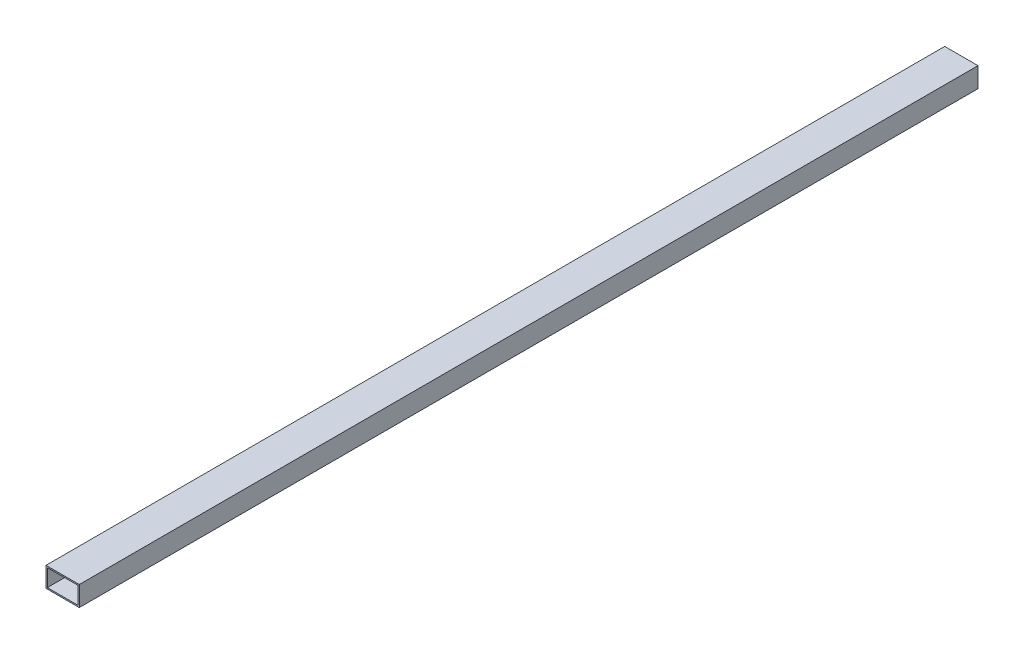
ISO-10303-21;
HEADER;
FILE_DESCRIPTION(('STEP AP214'),'2;1');
FILE_NAME('part.step','',(''),(''),'','','');
FILE_SCHEMA(('AUTOMOTIVE_DESIGN { 1 0 10303 214 1 1 1 1 }'));
ENDSEC;
DATA;
#1=APPLICATION_CONTEXT('core data for automotive mechanical design processes');
#2=APPLICATION_PROTOCOL_DEFINITION('international standard','automotive_design',2000,#1);
#3=PRODUCT_CONTEXT('',#1,'mechanical');
#4=PRODUCT('Part','Part','',(#3));
#5=PRODUCT_RELATED_PRODUCT_CATEGORY('part','',(#4));
#6=PRODUCT_DEFINITION_FORMATION('','',#4);
#7=PRODUCT_DEFINITION_CONTEXT('part definition',#1,'design');
#8=PRODUCT_DEFINITION('design','',#6,#7);
#9=PRODUCT_DEFINITION_SHAPE('','',#8);
#10=(LENGTH_UNIT() NAMED_UNIT(*) SI_UNIT(.MILLI.,.METRE.));
#11=(NAMED_UNIT(*) PLANE_ANGLE_UNIT() SI_UNIT($,.RADIAN.));
#12=(NAMED_UNIT(*) SI_UNIT($,.STERADIAN.) SOLID_ANGLE_UNIT());
#13=UNCERTAINTY_MEASURE_WITH_UNIT(LENGTH_MEASURE(1.E-05),#10,'distance_accuracy_value','');
#14=(GEOMETRIC_REPRESENTATION_CONTEXT(3) GLOBAL_UNCERTAINTY_ASSIGNED_CONTEXT((#13)) GLOBAL_UNIT_ASSIGNED_CONTEXT((#10,
#11,#12)) REPRESENTATION_CONTEXT('',''));
#15=CARTESIAN_POINT('',(0.,0.,0.));
#16=DIRECTION('',(0.,0.,1.));
#17=DIRECTION('',(1.,0.,0.));
#18=AXIS2_PLACEMENT_3D('',#15,#16,#17);
#19=CARTESIAN_POINT('',(0.,0.,1350.));
#20=DIRECTION('',(0.,0.,-1.));
#21=DIRECTION('',(-1.,0.,0.));
#22=AXIS2_PLACEMENT_3D('',#19,#20,#21);
#23=PLANE('',#22);
#24=DIRECTION('',(0.,-1.,0.));
#25=VECTOR('',#24,1.);
#26=CARTESIAN_POINT('',(0.,0.,1350.));
#27=LINE('',#26,#25);
#28=CARTESIAN_POINT('',(0.,30.,1350.));
#29=VERTEX_POINT('',#28);
#30=CARTESIAN_POINT('',(0.,0.,1350.));
#31=VERTEX_POINT('',#30);
#32=EDGE_CURVE('E138',#29,#31,#27,.T.);
#33=ORIENTED_EDGE('',*,*,#32,.T.);
#34=DIRECTION('',(1.,0.,0.));
#35=VECTOR('',#34,1.);
#36=CARTESIAN_POINT('',(0.,0.,1350.));
#37=LINE('',#36,#35);
#38=CARTESIAN_POINT('',(50.,0.,1350.));
#39=VERTEX_POINT('',#38);
#40=EDGE_CURVE('E141',#31,#39,#37,.T.);
#41=ORIENTED_EDGE('',*,*,#40,.T.);
#42=DIRECTION('',(0.,1.,0.));
#43=VECTOR('',#42,1.);
#44=CARTESIAN_POINT('',(50.,0.,1350.));
#45=LINE('',#44,#43);
#46=CARTESIAN_POINT('',(50.,30.,1350.));
#47=VERTEX_POINT('',#46);
#48=EDGE_CURVE('E144',#39,#47,#45,.T.);
#49=ORIENTED_EDGE('',*,*,#48,.T.);
#50=DIRECTION('',(-1.,0.,0.));
#51=VECTOR('',#50,1.);
#52=CARTESIAN_POINT('',(0.,30.,1350.));
#53=LINE('',#52,#51);
#54=EDGE_CURVE('E146',#47,#29,#53,.T.);
#55=ORIENTED_EDGE('',*,*,#54,.T.);
#56=EDGE_LOOP('',(#33,#41,#49,#55));
#57=FACE_BOUND('',#56,.T.);
#58=DIRECTION('',(0.,-1.,0.));
#59=VECTOR('',#58,1.);
#60=CARTESIAN_POINT('',(2.,0.,1350.));
#61=LINE('',#60,#59);
#62=CARTESIAN_POINT('',(1.99999999999999,28.,1350.));
#63=VERTEX_POINT('',#62);
#64=CARTESIAN_POINT('',(2.,2.,1350.));
#65=VERTEX_POINT('',#64);
#66=EDGE_CURVE('E126',#63,#65,#61,.T.);
#67=ORIENTED_EDGE('',*,*,#66,.F.);
#68=DIRECTION('',(-1.,0.,0.));
#69=VECTOR('',#68,1.);
#70=CARTESIAN_POINT('',(0.,28.,1350.));
#71=LINE('',#70,#69);
#72=CARTESIAN_POINT('',(48.,28.,1350.));
#73=VERTEX_POINT('',#72);
#74=EDGE_CURVE('E111',#73,#63,#71,.T.);
#75=ORIENTED_EDGE('',*,*,#74,.F.);
#76=DIRECTION('',(0.,1.,0.));
#77=VECTOR('',#76,1.);
#78=CARTESIAN_POINT('',(48.,0.,1350.));
#79=LINE('',#78,#77);
#80=CARTESIAN_POINT('',(48.,2.,1350.));
#81=VERTEX_POINT('',#80);
#82=EDGE_CURVE('E135',#81,#73,#79,.T.);
#83=ORIENTED_EDGE('',*,*,#82,.F.);
#84=DIRECTION('',(1.,0.,0.));
#85=VECTOR('',#84,1.);
#86=CARTESIAN_POINT('',(0.,2.,1350.));
#87=LINE('',#86,#85);
#88=EDGE_CURVE('E128',#65,#81,#87,.T.);
#89=ORIENTED_EDGE('',*,*,#88,.F.);
#90=EDGE_LOOP('',(#67,#75,#83,#89));
#91=FACE_BOUND('',#90,.T.);
#92=ADVANCED_FACE('F41',(#57,#91),#23,.F.);
#93=CARTESIAN_POINT('',(0.,0.,0.));
#94=DIRECTION('',(0.,0.,-1.));
#95=DIRECTION('',(-1.,0.,0.));
#96=AXIS2_PLACEMENT_3D('',#93,#94,#95);
#97=PLANE('',#96);
#98=DIRECTION('',(0.,-1.,0.));
#99=VECTOR('',#98,1.);
#100=CARTESIAN_POINT('',(0.,0.,0.));
#101=LINE('',#100,#99);
#102=CARTESIAN_POINT('',(0.,30.,0.));
#103=VERTEX_POINT('',#102);
#104=CARTESIAN_POINT('',(0.,0.,0.));
#105=VERTEX_POINT('',#104);
#106=EDGE_CURVE('E149',#103,#105,#101,.T.);
#107=ORIENTED_EDGE('',*,*,#106,.F.);
#108=DIRECTION('',(-1.,0.,0.));
#109=VECTOR('',#108,1.);
#110=CARTESIAN_POINT('',(0.,30.,0.));
#111=LINE('',#110,#109);
#112=CARTESIAN_POINT('',(50.,30.,0.));
#113=VERTEX_POINT('',#112);
#114=EDGE_CURVE('E142',#113,#103,#111,.T.);
#115=ORIENTED_EDGE('',*,*,#114,.F.);
#116=DIRECTION('',(0.,1.,0.));
#117=VECTOR('',#116,1.);
#118=CARTESIAN_POINT('',(50.,0.,0.));
#119=LINE('',#118,#117);
#120=CARTESIAN_POINT('',(50.,0.,0.));
#121=VERTEX_POINT('',#120);
#122=EDGE_CURVE('E154',#121,#113,#119,.T.);
#123=ORIENTED_EDGE('',*,*,#122,.F.);
#124=DIRECTION('',(1.,0.,0.));
#125=VECTOR('',#124,1.);
#126=CARTESIAN_POINT('',(0.,0.,0.));
#127=LINE('',#126,#125);
#128=EDGE_CURVE('E152',#105,#121,#127,.T.);
#129=ORIENTED_EDGE('',*,*,#128,.F.);
#130=EDGE_LOOP('',(#107,#115,#123,#129));
#131=FACE_BOUND('',#130,.T.);
#132=DIRECTION('',(-1.,0.,0.));
#133=VECTOR('',#132,1.);
#134=CARTESIAN_POINT('',(0.,28.,0.));
#135=LINE('',#134,#133);
#136=CARTESIAN_POINT('',(48.,28.,0.));
#137=VERTEX_POINT('',#136);
#138=CARTESIAN_POINT('',(1.99999999999999,28.,0.));
#139=VERTEX_POINT('',#138);
#140=EDGE_CURVE('E109',#137,#139,#135,.T.);
#141=ORIENTED_EDGE('',*,*,#140,.T.);
#142=DIRECTION('',(0.,-1.,0.));
#143=VECTOR('',#142,1.);
#144=CARTESIAN_POINT('',(2.,0.,0.));
#145=LINE('',#144,#143);
#146=CARTESIAN_POINT('',(2.,2.,0.));
#147=VERTEX_POINT('',#146);
#148=EDGE_CURVE('E117',#139,#147,#145,.T.);
#149=ORIENTED_EDGE('',*,*,#148,.T.);
#150=DIRECTION('',(1.,0.,0.));
#151=VECTOR('',#150,1.);
#152=CARTESIAN_POINT('',(0.,2.,0.));
#153=LINE('',#152,#151);
#154=CARTESIAN_POINT('',(48.,2.,0.));
#155=VERTEX_POINT('',#154);
#156=EDGE_CURVE('E123',#147,#155,#153,.T.);
#157=ORIENTED_EDGE('',*,*,#156,.T.);
#158=DIRECTION('',(0.,1.,0.));
#159=VECTOR('',#158,1.);
#160=CARTESIAN_POINT('',(48.,0.,0.));
#161=LINE('',#160,#159);
#162=EDGE_CURVE('E63',#155,#137,#161,.T.);
#163=ORIENTED_EDGE('',*,*,#162,.T.);
#164=EDGE_LOOP('',(#141,#149,#157,#163));
#165=FACE_BOUND('',#164,.T.);
#166=ADVANCED_FACE('F125',(#131,#165),#97,.T.);
#167=CARTESIAN_POINT('',(0.,0.,1350.));
#168=DIRECTION('',(1.,0.,0.));
#169=DIRECTION('',(0.,1.,0.));
#170=AXIS2_PLACEMENT_3D('',#167,#168,#169);
#171=PLANE('',#170);
#172=ORIENTED_EDGE('',*,*,#106,.T.);
#173=DIRECTION('',(0.,0.,-1.));
#174=VECTOR('',#173,1.);
#175=CARTESIAN_POINT('',(0.,0.,1350.));
#176=LINE('',#175,#174);
#177=EDGE_CURVE('E11',#31,#105,#176,.T.);
#178=ORIENTED_EDGE('',*,*,#177,.F.);
#179=ORIENTED_EDGE('',*,*,#32,.F.);
#180=DIRECTION('',(0.,0.,-1.));
#181=VECTOR('',#180,1.);
#182=CARTESIAN_POINT('',(0.,30.,1350.));
#183=LINE('',#182,#181);
#184=EDGE_CURVE('E148',#29,#103,#183,.T.);
#185=ORIENTED_EDGE('',*,*,#184,.T.);
#186=EDGE_LOOP('',(#172,#178,#179,#185));
#187=FACE_BOUND('',#186,.T.);
#188=ADVANCED_FACE('F43',(#187),#171,.F.);
#189=CARTESIAN_POINT('',(0.,0.,1350.));
#190=DIRECTION('',(0.,1.,0.));
#191=DIRECTION('',(0.,0.,1.));
#192=AXIS2_PLACEMENT_3D('',#189,#190,#191);
#193=PLANE('',#192);
#194=ORIENTED_EDGE('',*,*,#128,.T.);
#195=DIRECTION('',(0.,0.,-1.));
#196=VECTOR('',#195,1.);
#197=CARTESIAN_POINT('',(50.,0.,1350.));
#198=LINE('',#197,#196);
#199=EDGE_CURVE('E49',#39,#121,#198,.T.);
#200=ORIENTED_EDGE('',*,*,#199,.F.);
#201=ORIENTED_EDGE('',*,*,#40,.F.);
#202=ORIENTED_EDGE('',*,*,#177,.T.);
#203=EDGE_LOOP('',(#194,#200,#201,#202));
#204=FACE_BOUND('',#203,.T.);
#205=ADVANCED_FACE('F181',(#204),#193,.F.);
#206=CARTESIAN_POINT('',(50.,0.,1350.));
#207=DIRECTION('',(-1.,0.,0.));
#208=DIRECTION('',(0.,-1.,0.));
#209=AXIS2_PLACEMENT_3D('',#206,#207,#208);
#210=PLANE('',#209);
#211=ORIENTED_EDGE('',*,*,#122,.T.);
#212=DIRECTION('',(0.,0.,-1.));
#213=VECTOR('',#212,1.);
#214=CARTESIAN_POINT('',(50.,30.,1350.));
#215=LINE('',#214,#213);
#216=EDGE_CURVE('E159',#47,#113,#215,.T.);
#217=ORIENTED_EDGE('',*,*,#216,.F.);
#218=ORIENTED_EDGE('',*,*,#48,.F.);
#219=ORIENTED_EDGE('',*,*,#199,.T.);
#220=EDGE_LOOP('',(#211,#217,#218,#219));
#221=FACE_BOUND('',#220,.T.);
#222=ADVANCED_FACE('F166',(#221),#210,.F.);
#223=CARTESIAN_POINT('',(0.,30.,1350.));
#224=DIRECTION('',(0.,-1.,0.));
#225=DIRECTION('',(0.,0.,-1.));
#226=AXIS2_PLACEMENT_3D('',#223,#224,#225);
#227=PLANE('',#226);
#228=ORIENTED_EDGE('',*,*,#114,.T.);
#229=ORIENTED_EDGE('',*,*,#184,.F.);
#230=ORIENTED_EDGE('',*,*,#54,.F.);
#231=ORIENTED_EDGE('',*,*,#216,.T.);
#232=EDGE_LOOP('',(#228,#229,#230,#231));
#233=FACE_BOUND('',#232,.T.);
#234=ADVANCED_FACE('F174',(#233),#227,.F.);
#235=CARTESIAN_POINT('',(2.,0.,1350.));
#236=DIRECTION('',(1.,0.,0.));
#237=DIRECTION('',(0.,1.,0.));
#238=AXIS2_PLACEMENT_3D('',#235,#236,#237);
#239=PLANE('',#238);
#240=ORIENTED_EDGE('',*,*,#148,.F.);
#241=DIRECTION('',(0.,0.,-1.));
#242=VECTOR('',#241,1.);
#243=CARTESIAN_POINT('',(1.99999999999999,28.,1350.));
#244=LINE('',#243,#242);
#245=EDGE_CURVE('E105',#63,#139,#244,.T.);
#246=ORIENTED_EDGE('',*,*,#245,.F.);
#247=ORIENTED_EDGE('',*,*,#66,.T.);
#248=DIRECTION('',(0.,0.,-1.));
#249=VECTOR('',#248,1.);
#250=CARTESIAN_POINT('',(2.,2.,1350.));
#251=LINE('',#250,#249);
#252=EDGE_CURVE('E120',#65,#147,#251,.T.);
#253=ORIENTED_EDGE('',*,*,#252,.T.);
#254=EDGE_LOOP('',(#240,#246,#247,#253));
#255=FACE_BOUND('',#254,.T.);
#256=ADVANCED_FACE('F118',(#255),#239,.T.);
#257=CARTESIAN_POINT('',(0.,2.,1350.));
#258=DIRECTION('',(0.,1.,0.));
#259=DIRECTION('',(0.,0.,1.));
#260=AXIS2_PLACEMENT_3D('',#257,#258,#259);
#261=PLANE('',#260);
#262=ORIENTED_EDGE('',*,*,#156,.F.);
#263=ORIENTED_EDGE('',*,*,#252,.F.);
#264=ORIENTED_EDGE('',*,*,#88,.T.);
#265=DIRECTION('',(0.,0.,-1.));
#266=VECTOR('',#265,1.);
#267=CARTESIAN_POINT('',(48.,2.,1350.));
#268=LINE('',#267,#266);
#269=EDGE_CURVE('E264',#81,#155,#268,.T.);
#270=ORIENTED_EDGE('',*,*,#269,.T.);
#271=EDGE_LOOP('',(#262,#263,#264,#270));
#272=FACE_BOUND('',#271,.T.);
#273=ADVANCED_FACE('F201',(#272),#261,.T.);
#274=CARTESIAN_POINT('',(48.,0.,1350.));
#275=DIRECTION('',(-1.,0.,0.));
#276=DIRECTION('',(0.,-1.,0.));
#277=AXIS2_PLACEMENT_3D('',#274,#275,#276);
#278=PLANE('',#277);
#279=ORIENTED_EDGE('',*,*,#162,.F.);
#280=ORIENTED_EDGE('',*,*,#269,.F.);
#281=ORIENTED_EDGE('',*,*,#82,.T.);
#282=DIRECTION('',(0.,0.,-1.));
#283=VECTOR('',#282,1.);
#284=CARTESIAN_POINT('',(48.,28.,1350.));
#285=LINE('',#284,#283);
#286=EDGE_CURVE('E56',#73,#137,#285,.T.);
#287=ORIENTED_EDGE('',*,*,#286,.T.);
#288=EDGE_LOOP('',(#279,#280,#281,#287));
#289=FACE_BOUND('',#288,.T.);
#290=ADVANCED_FACE('F206',(#289),#278,.T.);
#291=CARTESIAN_POINT('',(0.,28.,1350.));
#292=DIRECTION('',(0.,-1.,0.));
#293=DIRECTION('',(0.,0.,-1.));
#294=AXIS2_PLACEMENT_3D('',#291,#292,#293);
#295=PLANE('',#294);
#296=ORIENTED_EDGE('',*,*,#140,.F.);
#297=ORIENTED_EDGE('',*,*,#286,.F.);
#298=ORIENTED_EDGE('',*,*,#74,.T.);
#299=ORIENTED_EDGE('',*,*,#245,.T.);
#300=EDGE_LOOP('',(#296,#297,#298,#299));
#301=FACE_BOUND('',#300,.T.);
#302=ADVANCED_FACE('F107',(#301),#295,.T.);
#303=CLOSED_SHELL('',(#92,#166,#188,#205,#222,#234,#256,#273,#290,#302));
#304=MANIFOLD_SOLID_BREP('B2',#303);
#305=ADVANCED_BREP_SHAPE_REPRESENTATION('',(#18,#304),#14);
#306=SHAPE_DEFINITION_REPRESENTATION(#9,#305);
ENDSEC;
END-ISO-10303-21;
